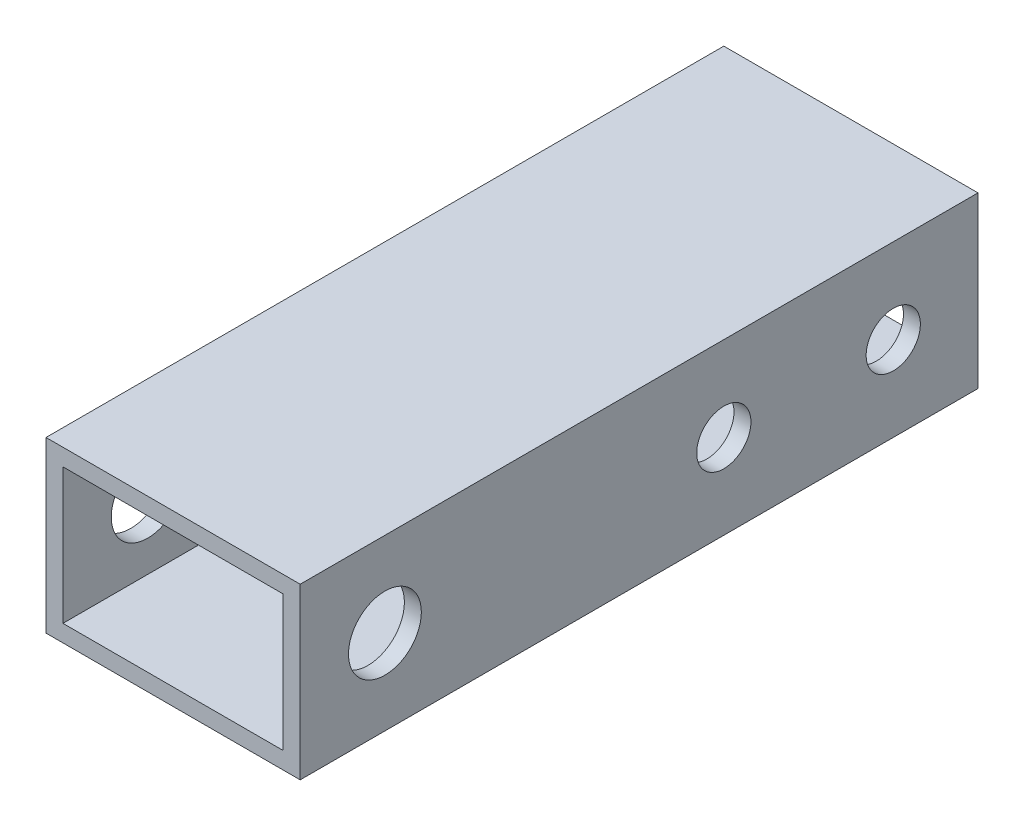
ISO-10303-21;
HEADER;
FILE_DESCRIPTION(('STEP AP214'),'2;1');
FILE_NAME('part.step','',(''),(''),'','','');
FILE_SCHEMA(('AUTOMOTIVE_DESIGN { 1 0 10303 214 1 1 1 1 }'));
ENDSEC;
DATA;
#1=APPLICATION_CONTEXT('core data for automotive mechanical design processes');
#2=APPLICATION_PROTOCOL_DEFINITION('international standard','automotive_design',2000,#1);
#3=PRODUCT_CONTEXT('',#1,'mechanical');
#4=PRODUCT('Part','Part','',(#3));
#5=PRODUCT_RELATED_PRODUCT_CATEGORY('part','',(#4));
#6=PRODUCT_DEFINITION_FORMATION('','',#4);
#7=PRODUCT_DEFINITION_CONTEXT('part definition',#1,'design');
#8=PRODUCT_DEFINITION('design','',#6,#7);
#9=PRODUCT_DEFINITION_SHAPE('','',#8);
#10=(LENGTH_UNIT() NAMED_UNIT(*) SI_UNIT(.MILLI.,.METRE.));
#11=(NAMED_UNIT(*) PLANE_ANGLE_UNIT() SI_UNIT($,.RADIAN.));
#12=(NAMED_UNIT(*) SI_UNIT($,.STERADIAN.) SOLID_ANGLE_UNIT());
#13=UNCERTAINTY_MEASURE_WITH_UNIT(LENGTH_MEASURE(1.E-05),#10,'distance_accuracy_value','');
#14=(GEOMETRIC_REPRESENTATION_CONTEXT(3) GLOBAL_UNCERTAINTY_ASSIGNED_CONTEXT((#13)) GLOBAL_UNIT_ASSIGNED_CONTEXT((#10,
#11,#12)) REPRESENTATION_CONTEXT('',''));
#15=CARTESIAN_POINT('',(0.,0.,0.));
#16=DIRECTION('',(0.,0.,1.));
#17=DIRECTION('',(1.,0.,0.));
#18=AXIS2_PLACEMENT_3D('',#15,#16,#17);
#19=CARTESIAN_POINT('',(0.,0.,40.));
#20=DIRECTION('',(0.,0.,1.));
#21=DIRECTION('',(1.,0.,0.));
#22=AXIS2_PLACEMENT_3D('',#19,#20,#21);
#23=PLANE('',#22);
#24=DIRECTION('',(0.,-1.,0.));
#25=VECTOR('',#24,1.);
#26=CARTESIAN_POINT('',(0.,0.,40.));
#27=LINE('',#26,#25);
#28=CARTESIAN_POINT('',(0.,10.,40.));
#29=VERTEX_POINT('',#28);
#30=CARTESIAN_POINT('',(0.,0.,40.));
#31=VERTEX_POINT('',#30);
#32=EDGE_CURVE('E164',#29,#31,#27,.T.);
#33=ORIENTED_EDGE('',*,*,#32,.T.);
#34=DIRECTION('',(1.,0.,0.));
#35=VECTOR('',#34,1.);
#36=CARTESIAN_POINT('',(0.,0.,40.));
#37=LINE('',#36,#35);
#38=CARTESIAN_POINT('',(15.,0.,40.));
#39=VERTEX_POINT('',#38);
#40=EDGE_CURVE('E167',#31,#39,#37,.T.);
#41=ORIENTED_EDGE('',*,*,#40,.T.);
#42=DIRECTION('',(0.,1.,0.));
#43=VECTOR('',#42,1.);
#44=CARTESIAN_POINT('',(15.,0.,40.));
#45=LINE('',#44,#43);
#46=CARTESIAN_POINT('',(15.,10.,40.));
#47=VERTEX_POINT('',#46);
#48=EDGE_CURVE('E170',#39,#47,#45,.T.);
#49=ORIENTED_EDGE('',*,*,#48,.T.);
#50=DIRECTION('',(-1.,0.,0.));
#51=VECTOR('',#50,1.);
#52=CARTESIAN_POINT('',(0.,10.,40.));
#53=LINE('',#52,#51);
#54=EDGE_CURVE('E172',#47,#29,#53,.T.);
#55=ORIENTED_EDGE('',*,*,#54,.T.);
#56=EDGE_LOOP('',(#33,#41,#49,#55));
#57=FACE_BOUND('',#56,.T.);
#58=DIRECTION('',(1.,0.,0.));
#59=VECTOR('',#58,1.);
#60=CARTESIAN_POINT('',(0.,1.,40.));
#61=LINE('',#60,#59);
#62=CARTESIAN_POINT('',(1.,1.,40.));
#63=VERTEX_POINT('',#62);
#64=CARTESIAN_POINT('',(14.,1.,40.));
#65=VERTEX_POINT('',#64);
#66=EDGE_CURVE('E134',#63,#65,#61,.T.);
#67=ORIENTED_EDGE('',*,*,#66,.F.);
#68=DIRECTION('',(0.,-1.,0.));
#69=VECTOR('',#68,1.);
#70=CARTESIAN_POINT('',(1.,0.,40.));
#71=LINE('',#70,#69);
#72=CARTESIAN_POINT('',(1.,9.,40.));
#73=VERTEX_POINT('',#72);
#74=EDGE_CURVE('E126',#73,#63,#71,.T.);
#75=ORIENTED_EDGE('',*,*,#74,.F.);
#76=DIRECTION('',(-1.,0.,0.));
#77=VECTOR('',#76,1.);
#78=CARTESIAN_POINT('',(0.,9.,40.));
#79=LINE('',#78,#77);
#80=CARTESIAN_POINT('',(14.,9.,40.));
#81=VERTEX_POINT('',#80);
#82=EDGE_CURVE('E148',#81,#73,#79,.T.);
#83=ORIENTED_EDGE('',*,*,#82,.F.);
#84=DIRECTION('',(0.,1.,0.));
#85=VECTOR('',#84,1.);
#86=CARTESIAN_POINT('',(14.,0.,40.));
#87=LINE('',#86,#85);
#88=EDGE_CURVE('E146',#65,#81,#87,.T.);
#89=ORIENTED_EDGE('',*,*,#88,.F.);
#90=EDGE_LOOP('',(#67,#75,#83,#89));
#91=FACE_BOUND('',#90,.T.);
#92=ADVANCED_FACE('F59',(#57,#91),#23,.T.);
#93=CARTESIAN_POINT('',(0.,0.,0.));
#94=DIRECTION('',(0.,0.,1.));
#95=DIRECTION('',(1.,0.,0.));
#96=AXIS2_PLACEMENT_3D('',#93,#94,#95);
#97=PLANE('',#96);
#98=DIRECTION('',(0.,-1.,0.));
#99=VECTOR('',#98,1.);
#100=CARTESIAN_POINT('',(0.,0.,0.));
#101=LINE('',#100,#99);
#102=CARTESIAN_POINT('',(0.,10.,0.));
#103=VERTEX_POINT('',#102);
#104=CARTESIAN_POINT('',(0.,0.,0.));
#105=VERTEX_POINT('',#104);
#106=EDGE_CURVE('E142',#103,#105,#101,.T.);
#107=ORIENTED_EDGE('',*,*,#106,.F.);
#108=DIRECTION('',(-1.,0.,0.));
#109=VECTOR('',#108,1.);
#110=CARTESIAN_POINT('',(0.,10.,0.));
#111=LINE('',#110,#109);
#112=CARTESIAN_POINT('',(15.,10.,0.));
#113=VERTEX_POINT('',#112);
#114=EDGE_CURVE('E168',#113,#103,#111,.T.);
#115=ORIENTED_EDGE('',*,*,#114,.F.);
#116=DIRECTION('',(0.,1.,0.));
#117=VECTOR('',#116,1.);
#118=CARTESIAN_POINT('',(15.,0.,0.));
#119=LINE('',#118,#117);
#120=CARTESIAN_POINT('',(15.,0.,0.));
#121=VERTEX_POINT('',#120);
#122=EDGE_CURVE('E179',#121,#113,#119,.T.);
#123=ORIENTED_EDGE('',*,*,#122,.F.);
#124=DIRECTION('',(1.,0.,0.));
#125=VECTOR('',#124,1.);
#126=CARTESIAN_POINT('',(0.,0.,0.));
#127=LINE('',#126,#125);
#128=EDGE_CURVE('E177',#105,#121,#127,.T.);
#129=ORIENTED_EDGE('',*,*,#128,.F.);
#130=EDGE_LOOP('',(#107,#115,#123,#129));
#131=FACE_BOUND('',#130,.T.);
#132=DIRECTION('',(0.,-1.,0.));
#133=VECTOR('',#132,1.);
#134=CARTESIAN_POINT('',(1.,0.,0.));
#135=LINE('',#134,#133);
#136=CARTESIAN_POINT('',(1.,9.,0.));
#137=VERTEX_POINT('',#136);
#138=CARTESIAN_POINT('',(1.,1.,0.));
#139=VERTEX_POINT('',#138);
#140=EDGE_CURVE('E84',#137,#139,#135,.T.);
#141=ORIENTED_EDGE('',*,*,#140,.T.);
#142=DIRECTION('',(1.,0.,0.));
#143=VECTOR('',#142,1.);
#144=CARTESIAN_POINT('',(0.,1.,0.));
#145=LINE('',#144,#143);
#146=CARTESIAN_POINT('',(14.,1.,0.));
#147=VERTEX_POINT('',#146);
#148=EDGE_CURVE('E141',#139,#147,#145,.T.);
#149=ORIENTED_EDGE('',*,*,#148,.T.);
#150=DIRECTION('',(0.,1.,0.));
#151=VECTOR('',#150,1.);
#152=CARTESIAN_POINT('',(14.,0.,0.));
#153=LINE('',#152,#151);
#154=CARTESIAN_POINT('',(14.,9.,0.));
#155=VERTEX_POINT('',#154);
#156=EDGE_CURVE('E156',#147,#155,#153,.T.);
#157=ORIENTED_EDGE('',*,*,#156,.T.);
#158=DIRECTION('',(-1.,0.,0.));
#159=VECTOR('',#158,1.);
#160=CARTESIAN_POINT('',(0.,9.,0.));
#161=LINE('',#160,#159);
#162=EDGE_CURVE('E135',#155,#137,#161,.T.);
#163=ORIENTED_EDGE('',*,*,#162,.T.);
#164=EDGE_LOOP('',(#141,#149,#157,#163));
#165=FACE_BOUND('',#164,.T.);
#166=ADVANCED_FACE('F226',(#131,#165),#97,.F.);
#167=CARTESIAN_POINT('',(0.,0.,40.));
#168=DIRECTION('',(1.,0.,0.));
#169=DIRECTION('',(0.,0.,-1.));
#170=AXIS2_PLACEMENT_3D('',#167,#168,#169);
#171=PLANE('',#170);
#172=CARTESIAN_POINT('',(0.,5.,5.));
#173=DIRECTION('',(1.,0.,0.));
#174=DIRECTION('',(0.,0.,-1.));
#175=AXIS2_PLACEMENT_3D('',#172,#173,#174);
#176=CIRCLE('',#175,1.6);
#177=CARTESIAN_POINT('',(0.,5.,3.4));
#178=VERTEX_POINT('',#177);
#179=EDGE_CURVE('E192',#178,#178,#176,.F.);
#180=ORIENTED_EDGE('',*,*,#179,.F.);
#181=EDGE_LOOP('',(#180));
#182=FACE_BOUND('',#181,.T.);
#183=CARTESIAN_POINT('',(0.,5.,15.));
#184=DIRECTION('',(1.,0.,0.));
#185=DIRECTION('',(0.,0.,-1.));
#186=AXIS2_PLACEMENT_3D('',#183,#184,#185);
#187=CIRCLE('',#186,1.6);
#188=CARTESIAN_POINT('',(0.,5.,13.4));
#189=VERTEX_POINT('',#188);
#190=EDGE_CURVE('E282',#189,#189,#187,.F.);
#191=ORIENTED_EDGE('',*,*,#190,.F.);
#192=EDGE_LOOP('',(#191));
#193=FACE_BOUND('',#192,.T.);
#194=CARTESIAN_POINT('',(0.,5.,35.));
#195=DIRECTION('',(1.,0.,0.));
#196=DIRECTION('',(0.,0.,-1.));
#197=AXIS2_PLACEMENT_3D('',#194,#195,#196);
#198=CIRCLE('',#197,2.15);
#199=CARTESIAN_POINT('',(0.,5.,32.85));
#200=VERTEX_POINT('',#199);
#201=EDGE_CURVE('E205',#200,#200,#198,.F.);
#202=ORIENTED_EDGE('',*,*,#201,.F.);
#203=EDGE_LOOP('',(#202));
#204=FACE_BOUND('',#203,.T.);
#205=ORIENTED_EDGE('',*,*,#106,.T.);
#206=DIRECTION('',(0.,0.,-1.));
#207=VECTOR('',#206,1.);
#208=CARTESIAN_POINT('',(0.,0.,40.));
#209=LINE('',#208,#207);
#210=EDGE_CURVE('E12',#31,#105,#209,.T.);
#211=ORIENTED_EDGE('',*,*,#210,.F.);
#212=ORIENTED_EDGE('',*,*,#32,.F.);
#213=DIRECTION('',(0.,0.,-1.));
#214=VECTOR('',#213,1.);
#215=CARTESIAN_POINT('',(0.,10.,40.));
#216=LINE('',#215,#214);
#217=EDGE_CURVE('E174',#29,#103,#216,.T.);
#218=ORIENTED_EDGE('',*,*,#217,.T.);
#219=EDGE_LOOP('',(#205,#211,#212,#218));
#220=FACE_BOUND('',#219,.T.);
#221=ADVANCED_FACE('F61',(#182,#193,#204,#220),#171,.F.);
#222=CARTESIAN_POINT('',(0.,0.,40.));
#223=DIRECTION('',(0.,1.,0.));
#224=DIRECTION('',(0.,0.,1.));
#225=AXIS2_PLACEMENT_3D('',#222,#223,#224);
#226=PLANE('',#225);
#227=ORIENTED_EDGE('',*,*,#128,.T.);
#228=DIRECTION('',(0.,0.,-1.));
#229=VECTOR('',#228,1.);
#230=CARTESIAN_POINT('',(15.,0.,40.));
#231=LINE('',#230,#229);
#232=EDGE_CURVE('E68',#39,#121,#231,.T.);
#233=ORIENTED_EDGE('',*,*,#232,.F.);
#234=ORIENTED_EDGE('',*,*,#40,.F.);
#235=ORIENTED_EDGE('',*,*,#210,.T.);
#236=EDGE_LOOP('',(#227,#233,#234,#235));
#237=FACE_BOUND('',#236,.T.);
#238=ADVANCED_FACE('F254',(#237),#226,.F.);
#239=CARTESIAN_POINT('',(15.,0.,40.));
#240=DIRECTION('',(-1.,0.,0.));
#241=DIRECTION('',(0.,0.,1.));
#242=AXIS2_PLACEMENT_3D('',#239,#240,#241);
#243=PLANE('',#242);
#244=CARTESIAN_POINT('',(15.,5.,5.));
#245=DIRECTION('',(1.,0.,0.));
#246=DIRECTION('',(0.,0.,-1.));
#247=AXIS2_PLACEMENT_3D('',#244,#245,#246);
#248=CIRCLE('',#247,1.6);
#249=CARTESIAN_POINT('',(15.,5.,3.4));
#250=VERTEX_POINT('',#249);
#251=EDGE_CURVE('E294',#250,#250,#248,.T.);
#252=ORIENTED_EDGE('',*,*,#251,.F.);
#253=EDGE_LOOP('',(#252));
#254=FACE_BOUND('',#253,.T.);
#255=CARTESIAN_POINT('',(15.,5.,15.));
#256=DIRECTION('',(1.,0.,0.));
#257=DIRECTION('',(0.,0.,-1.));
#258=AXIS2_PLACEMENT_3D('',#255,#256,#257);
#259=CIRCLE('',#258,1.6);
#260=CARTESIAN_POINT('',(15.,5.,13.4));
#261=VERTEX_POINT('',#260);
#262=EDGE_CURVE('E286',#261,#261,#259,.T.);
#263=ORIENTED_EDGE('',*,*,#262,.F.);
#264=EDGE_LOOP('',(#263));
#265=FACE_BOUND('',#264,.T.);
#266=CARTESIAN_POINT('',(15.,5.,35.));
#267=DIRECTION('',(1.,0.,0.));
#268=DIRECTION('',(0.,0.,-1.));
#269=AXIS2_PLACEMENT_3D('',#266,#267,#268);
#270=CIRCLE('',#269,2.15);
#271=CARTESIAN_POINT('',(15.,5.,32.85));
#272=VERTEX_POINT('',#271);
#273=EDGE_CURVE('E287',#272,#272,#270,.T.);
#274=ORIENTED_EDGE('',*,*,#273,.F.);
#275=EDGE_LOOP('',(#274));
#276=FACE_BOUND('',#275,.T.);
#277=ORIENTED_EDGE('',*,*,#122,.T.);
#278=DIRECTION('',(0.,0.,-1.));
#279=VECTOR('',#278,1.);
#280=CARTESIAN_POINT('',(15.,10.,40.));
#281=LINE('',#280,#279);
#282=EDGE_CURVE('E184',#47,#113,#281,.T.);
#283=ORIENTED_EDGE('',*,*,#282,.F.);
#284=ORIENTED_EDGE('',*,*,#48,.F.);
#285=ORIENTED_EDGE('',*,*,#232,.T.);
#286=EDGE_LOOP('',(#277,#283,#284,#285));
#287=FACE_BOUND('',#286,.T.);
#288=ADVANCED_FACE('F251',(#254,#265,#276,#287),#243,.F.);
#289=CARTESIAN_POINT('',(0.,10.,40.));
#290=DIRECTION('',(0.,-1.,0.));
#291=DIRECTION('',(0.,0.,-1.));
#292=AXIS2_PLACEMENT_3D('',#289,#290,#291);
#293=PLANE('',#292);
#294=ORIENTED_EDGE('',*,*,#114,.T.);
#295=ORIENTED_EDGE('',*,*,#217,.F.);
#296=ORIENTED_EDGE('',*,*,#54,.F.);
#297=ORIENTED_EDGE('',*,*,#282,.T.);
#298=EDGE_LOOP('',(#294,#295,#296,#297));
#299=FACE_BOUND('',#298,.T.);
#300=ADVANCED_FACE('F248',(#299),#293,.F.);
#301=CARTESIAN_POINT('',(1.,0.,40.));
#302=DIRECTION('',(1.,0.,0.));
#303=DIRECTION('',(0.,0.,-1.));
#304=AXIS2_PLACEMENT_3D('',#301,#302,#303);
#305=PLANE('',#304);
#306=CARTESIAN_POINT('',(1.,5.,5.));
#307=DIRECTION('',(1.,0.,0.));
#308=DIRECTION('',(0.,0.,-1.));
#309=AXIS2_PLACEMENT_3D('',#306,#307,#308);
#310=CIRCLE('',#309,1.6);
#311=CARTESIAN_POINT('',(1.,5.,3.4));
#312=VERTEX_POINT('',#311);
#313=EDGE_CURVE('E154',#312,#312,#310,.T.);
#314=ORIENTED_EDGE('',*,*,#313,.F.);
#315=EDGE_LOOP('',(#314));
#316=FACE_BOUND('',#315,.T.);
#317=CARTESIAN_POINT('',(1.,5.,15.));
#318=DIRECTION('',(1.,0.,0.));
#319=DIRECTION('',(0.,0.,-1.));
#320=AXIS2_PLACEMENT_3D('',#317,#318,#319);
#321=CIRCLE('',#320,1.6);
#322=CARTESIAN_POINT('',(1.,5.,13.4));
#323=VERTEX_POINT('',#322);
#324=EDGE_CURVE('E195',#323,#323,#321,.T.);
#325=ORIENTED_EDGE('',*,*,#324,.F.);
#326=EDGE_LOOP('',(#325));
#327=FACE_BOUND('',#326,.T.);
#328=CARTESIAN_POINT('',(1.,5.,35.));
#329=DIRECTION('',(1.,0.,0.));
#330=DIRECTION('',(0.,0.,-1.));
#331=AXIS2_PLACEMENT_3D('',#328,#329,#330);
#332=CIRCLE('',#331,2.15);
#333=CARTESIAN_POINT('',(1.,5.,32.85));
#334=VERTEX_POINT('',#333);
#335=EDGE_CURVE('E191',#334,#334,#332,.T.);
#336=ORIENTED_EDGE('',*,*,#335,.F.);
#337=EDGE_LOOP('',(#336));
#338=FACE_BOUND('',#337,.T.);
#339=ORIENTED_EDGE('',*,*,#140,.F.);
#340=DIRECTION('',(0.,0.,-1.));
#341=VECTOR('',#340,1.);
#342=CARTESIAN_POINT('',(1.,9.,40.));
#343=LINE('',#342,#341);
#344=EDGE_CURVE('E130',#73,#137,#343,.T.);
#345=ORIENTED_EDGE('',*,*,#344,.F.);
#346=ORIENTED_EDGE('',*,*,#74,.T.);
#347=DIRECTION('',(0.,0.,-1.));
#348=VECTOR('',#347,1.);
#349=CARTESIAN_POINT('',(1.,1.,40.));
#350=LINE('',#349,#348);
#351=EDGE_CURVE('E129',#63,#139,#350,.T.);
#352=ORIENTED_EDGE('',*,*,#351,.T.);
#353=EDGE_LOOP('',(#339,#345,#346,#352));
#354=FACE_BOUND('',#353,.T.);
#355=ADVANCED_FACE('F128',(#316,#327,#338,#354),#305,.T.);
#356=CARTESIAN_POINT('',(0.,1.,40.));
#357=DIRECTION('',(0.,1.,0.));
#358=DIRECTION('',(0.,0.,1.));
#359=AXIS2_PLACEMENT_3D('',#356,#357,#358);
#360=PLANE('',#359);
#361=ORIENTED_EDGE('',*,*,#148,.F.);
#362=ORIENTED_EDGE('',*,*,#351,.F.);
#363=ORIENTED_EDGE('',*,*,#66,.T.);
#364=DIRECTION('',(0.,0.,-1.));
#365=VECTOR('',#364,1.);
#366=CARTESIAN_POINT('',(14.,1.,40.));
#367=LINE('',#366,#365);
#368=EDGE_CURVE('E143',#65,#147,#367,.T.);
#369=ORIENTED_EDGE('',*,*,#368,.T.);
#370=EDGE_LOOP('',(#361,#362,#363,#369));
#371=FACE_BOUND('',#370,.T.);
#372=ADVANCED_FACE('F138',(#371),#360,.T.);
#373=CARTESIAN_POINT('',(14.,0.,40.));
#374=DIRECTION('',(-1.,0.,0.));
#375=DIRECTION('',(0.,0.,1.));
#376=AXIS2_PLACEMENT_3D('',#373,#374,#375);
#377=PLANE('',#376);
#378=CARTESIAN_POINT('',(14.,5.,5.));
#379=DIRECTION('',(-1.,0.,0.));
#380=DIRECTION('',(0.,0.,1.));
#381=AXIS2_PLACEMENT_3D('',#378,#379,#380);
#382=CIRCLE('',#381,1.6);
#383=CARTESIAN_POINT('',(14.,5.,6.6));
#384=VERTEX_POINT('',#383);
#385=EDGE_CURVE('E63',#384,#384,#382,.T.);
#386=ORIENTED_EDGE('',*,*,#385,.F.);
#387=EDGE_LOOP('',(#386));
#388=FACE_BOUND('',#387,.T.);
#389=CARTESIAN_POINT('',(14.,5.,15.));
#390=DIRECTION('',(-1.,0.,0.));
#391=DIRECTION('',(0.,0.,1.));
#392=AXIS2_PLACEMENT_3D('',#389,#390,#391);
#393=CIRCLE('',#392,1.6);
#394=CARTESIAN_POINT('',(14.,5.,16.6));
#395=VERTEX_POINT('',#394);
#396=EDGE_CURVE('E193',#395,#395,#393,.T.);
#397=ORIENTED_EDGE('',*,*,#396,.F.);
#398=EDGE_LOOP('',(#397));
#399=FACE_BOUND('',#398,.T.);
#400=CARTESIAN_POINT('',(14.,5.,35.));
#401=DIRECTION('',(-1.,0.,0.));
#402=DIRECTION('',(0.,0.,1.));
#403=AXIS2_PLACEMENT_3D('',#400,#401,#402);
#404=CIRCLE('',#403,2.15);
#405=CARTESIAN_POINT('',(14.,5.,37.15));
#406=VERTEX_POINT('',#405);
#407=EDGE_CURVE('E189',#406,#406,#404,.T.);
#408=ORIENTED_EDGE('',*,*,#407,.F.);
#409=EDGE_LOOP('',(#408));
#410=FACE_BOUND('',#409,.T.);
#411=ORIENTED_EDGE('',*,*,#156,.F.);
#412=ORIENTED_EDGE('',*,*,#368,.F.);
#413=ORIENTED_EDGE('',*,*,#88,.T.);
#414=DIRECTION('',(0.,0.,-1.));
#415=VECTOR('',#414,1.);
#416=CARTESIAN_POINT('',(14.,9.,40.));
#417=LINE('',#416,#415);
#418=EDGE_CURVE('E76',#81,#155,#417,.T.);
#419=ORIENTED_EDGE('',*,*,#418,.T.);
#420=EDGE_LOOP('',(#411,#412,#413,#419));
#421=FACE_BOUND('',#420,.T.);
#422=ADVANCED_FACE('F216',(#388,#399,#410,#421),#377,.T.);
#423=CARTESIAN_POINT('',(0.,9.,40.));
#424=DIRECTION('',(0.,-1.,0.));
#425=DIRECTION('',(0.,0.,-1.));
#426=AXIS2_PLACEMENT_3D('',#423,#424,#425);
#427=PLANE('',#426);
#428=ORIENTED_EDGE('',*,*,#162,.F.);
#429=ORIENTED_EDGE('',*,*,#418,.F.);
#430=ORIENTED_EDGE('',*,*,#82,.T.);
#431=ORIENTED_EDGE('',*,*,#344,.T.);
#432=EDGE_LOOP('',(#428,#429,#430,#431));
#433=FACE_BOUND('',#432,.T.);
#434=ADVANCED_FACE('F219',(#433),#427,.T.);
#435=CARTESIAN_POINT('',(-6.08111831820431,5.,35.));
#436=DIRECTION('',(1.,0.,0.));
#437=DIRECTION('',(0.,0.,-1.));
#438=AXIS2_PLACEMENT_3D('',#435,#436,#437);
#439=CYLINDRICAL_SURFACE('',#438,2.15);
#440=ORIENTED_EDGE('',*,*,#407,.T.);
#441=EDGE_LOOP('',(#440));
#442=FACE_BOUND('',#441,.T.);
#443=ORIENTED_EDGE('',*,*,#273,.T.);
#444=EDGE_LOOP('',(#443));
#445=FACE_BOUND('',#444,.T.);
#446=ADVANCED_FACE('F228',(#442,#445),#439,.F.);
#447=CARTESIAN_POINT('',(-6.08111831820431,5.,15.));
#448=DIRECTION('',(1.,0.,0.));
#449=DIRECTION('',(0.,0.,-1.));
#450=AXIS2_PLACEMENT_3D('',#447,#448,#449);
#451=CYLINDRICAL_SURFACE('',#450,1.6);
#452=ORIENTED_EDGE('',*,*,#396,.T.);
#453=EDGE_LOOP('',(#452));
#454=FACE_BOUND('',#453,.T.);
#455=ORIENTED_EDGE('',*,*,#262,.T.);
#456=EDGE_LOOP('',(#455));
#457=FACE_BOUND('',#456,.T.);
#458=ADVANCED_FACE('F233',(#454,#457),#451,.F.);
#459=CARTESIAN_POINT('',(-6.08111831820431,5.,5.));
#460=DIRECTION('',(1.,0.,0.));
#461=DIRECTION('',(0.,0.,-1.));
#462=AXIS2_PLACEMENT_3D('',#459,#460,#461);
#463=CYLINDRICAL_SURFACE('',#462,1.6);
#464=ORIENTED_EDGE('',*,*,#385,.T.);
#465=EDGE_LOOP('',(#464));
#466=FACE_BOUND('',#465,.T.);
#467=ORIENTED_EDGE('',*,*,#251,.T.);
#468=EDGE_LOOP('',(#467));
#469=FACE_BOUND('',#468,.T.);
#470=ADVANCED_FACE('F213',(#466,#469),#463,.F.);
#471=ORIENTED_EDGE('',*,*,#335,.T.);
#472=EDGE_LOOP('',(#471));
#473=FACE_BOUND('',#472,.T.);
#474=ORIENTED_EDGE('',*,*,#201,.T.);
#475=EDGE_LOOP('',(#474));
#476=FACE_BOUND('',#475,.T.);
#477=ADVANCED_FACE('F236',(#473,#476),#439,.F.);
#478=ORIENTED_EDGE('',*,*,#324,.T.);
#479=EDGE_LOOP('',(#478));
#480=FACE_BOUND('',#479,.T.);
#481=ORIENTED_EDGE('',*,*,#190,.T.);
#482=EDGE_LOOP('',(#481));
#483=FACE_BOUND('',#482,.T.);
#484=ADVANCED_FACE('F305',(#480,#483),#451,.F.);
#485=ORIENTED_EDGE('',*,*,#313,.T.);
#486=EDGE_LOOP('',(#485));
#487=FACE_BOUND('',#486,.T.);
#488=ORIENTED_EDGE('',*,*,#179,.T.);
#489=EDGE_LOOP('',(#488));
#490=FACE_BOUND('',#489,.T.);
#491=ADVANCED_FACE('F310',(#487,#490),#463,.F.);
#492=CLOSED_SHELL('',(#92,#166,#221,#238,#288,#300,#355,#372,#422,#434,#446,#458,#470,#477,#484,#491));
#493=MANIFOLD_SOLID_BREP('B2',#492);
#494=ADVANCED_BREP_SHAPE_REPRESENTATION('',(#18,#493),#14);
#495=SHAPE_DEFINITION_REPRESENTATION(#9,#494);
ENDSEC;
END-ISO-10303-21;
